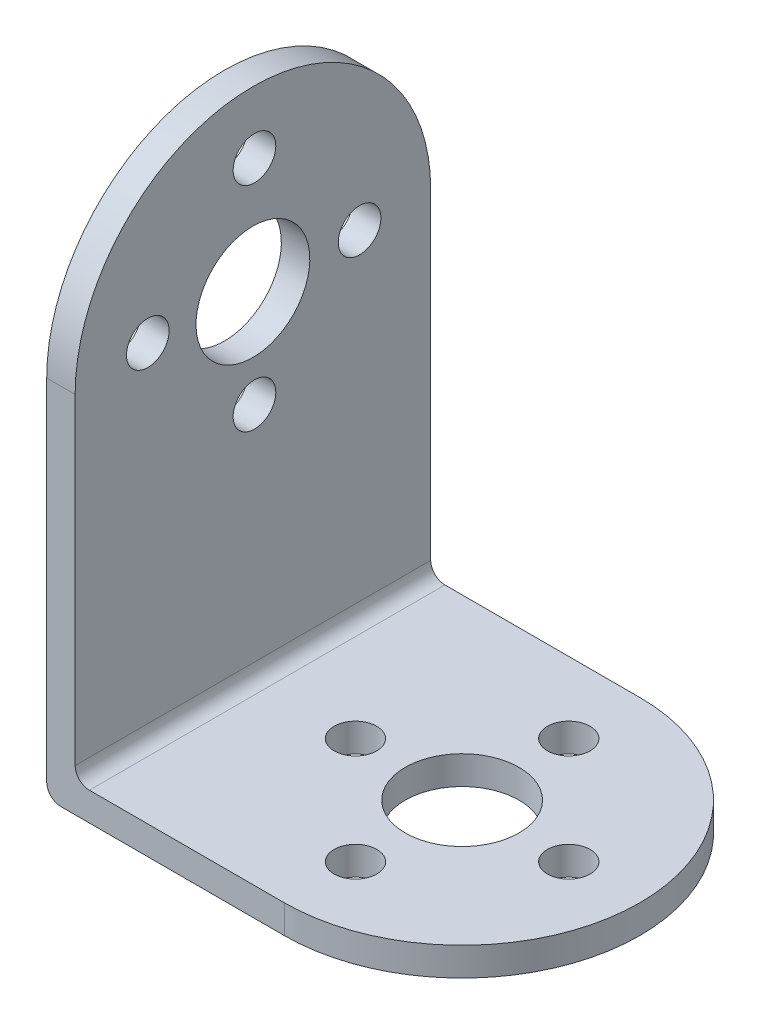
ISO-10303-21;
HEADER;
FILE_DESCRIPTION(('STEP AP214'),'2;1');
FILE_NAME('part.step','',(''),(''),'','','');
FILE_SCHEMA(('AUTOMOTIVE_DESIGN { 1 0 10303 214 1 1 1 1 }'));
ENDSEC;
DATA;
#1=APPLICATION_CONTEXT('core data for automotive mechanical design processes');
#2=APPLICATION_PROTOCOL_DEFINITION('international standard','automotive_design',2000,#1);
#3=PRODUCT_CONTEXT('',#1,'mechanical');
#4=PRODUCT('Part','Part','',(#3));
#5=PRODUCT_RELATED_PRODUCT_CATEGORY('part','',(#4));
#6=PRODUCT_DEFINITION_FORMATION('','',#4);
#7=PRODUCT_DEFINITION_CONTEXT('part definition',#1,'design');
#8=PRODUCT_DEFINITION('design','',#6,#7);
#9=PRODUCT_DEFINITION_SHAPE('','',#8);
#10=(LENGTH_UNIT() NAMED_UNIT(*) SI_UNIT(.MILLI.,.METRE.));
#11=(NAMED_UNIT(*) PLANE_ANGLE_UNIT() SI_UNIT($,.RADIAN.));
#12=(NAMED_UNIT(*) SI_UNIT($,.STERADIAN.) SOLID_ANGLE_UNIT());
#13=UNCERTAINTY_MEASURE_WITH_UNIT(LENGTH_MEASURE(1.E-05),#10,'distance_accuracy_value','');
#14=(GEOMETRIC_REPRESENTATION_CONTEXT(3) GLOBAL_UNCERTAINTY_ASSIGNED_CONTEXT((#13)) GLOBAL_UNIT_ASSIGNED_CONTEXT((#10,
#11,#12)) REPRESENTATION_CONTEXT('',''));
#15=CARTESIAN_POINT('',(0.,0.,0.));
#16=DIRECTION('',(0.,0.,1.));
#17=DIRECTION('',(1.,0.,0.));
#18=AXIS2_PLACEMENT_3D('',#15,#16,#17);
#19=CARTESIAN_POINT('',(0.,0.,25.));
#20=DIRECTION('',(-1.,0.,0.));
#21=DIRECTION('',(0.,0.,1.));
#22=AXIS2_PLACEMENT_3D('',#19,#20,#21);
#23=PLANE('',#22);
#24=CARTESIAN_POINT('',(0.,18.683987084255,12.3909513193394));
#25=DIRECTION('',(-1.,0.,0.));
#26=DIRECTION('',(0.,0.,1.));
#27=AXIS2_PLACEMENT_3D('',#24,#25,#26);
#28=CIRCLE('',#27,1.5);
#29=CARTESIAN_POINT('',(0.,18.683987084255,13.8909513193394));
#30=VERTEX_POINT('',#29);
#31=EDGE_CURVE('E377',#30,#30,#28,.T.);
#32=ORIENTED_EDGE('',*,*,#31,.F.);
#33=EDGE_LOOP('',(#32));
#34=FACE_BOUND('',#33,.T.);
#35=CARTESIAN_POINT('',(0.,25.6000000000001,12.5));
#36=DIRECTION('',(-1.,0.,0.));
#37=DIRECTION('',(0.,0.,1.));
#38=AXIS2_PLACEMENT_3D('',#35,#36,#37);
#39=CIRCLE('',#38,4.);
#40=CARTESIAN_POINT('',(0.,25.6000000000001,16.5));
#41=VERTEX_POINT('',#40);
#42=EDGE_CURVE('E387',#41,#41,#39,.T.);
#43=ORIENTED_EDGE('',*,*,#42,.F.);
#44=EDGE_LOOP('',(#43));
#45=FACE_BOUND('',#44,.T.);
#46=CARTESIAN_POINT('',(0.,26.183987084255,19.8909513193394));
#47=DIRECTION('',(-1.,0.,0.));
#48=DIRECTION('',(0.,0.,1.));
#49=AXIS2_PLACEMENT_3D('',#46,#47,#48);
#50=CIRCLE('',#49,1.5);
#51=CARTESIAN_POINT('',(0.,26.183987084255,21.3909513193394));
#52=VERTEX_POINT('',#51);
#53=EDGE_CURVE('E393',#52,#52,#50,.T.);
#54=ORIENTED_EDGE('',*,*,#53,.F.);
#55=EDGE_LOOP('',(#54));
#56=FACE_BOUND('',#55,.T.);
#57=CARTESIAN_POINT('',(0.,25.6000000000001,5.));
#58=DIRECTION('',(-1.,0.,0.));
#59=DIRECTION('',(0.,0.,1.));
#60=AXIS2_PLACEMENT_3D('',#57,#58,#59);
#61=CIRCLE('',#60,1.5);
#62=CARTESIAN_POINT('',(0.,25.6000000000001,6.50000000000001));
#63=VERTEX_POINT('',#62);
#64=EDGE_CURVE('E399',#63,#63,#61,.T.);
#65=ORIENTED_EDGE('',*,*,#64,.F.);
#66=EDGE_LOOP('',(#65));
#67=FACE_BOUND('',#66,.T.);
#68=CARTESIAN_POINT('',(0.,33.683987084255,12.3909513193394));
#69=DIRECTION('',(-1.,0.,0.));
#70=DIRECTION('',(0.,0.,1.));
#71=AXIS2_PLACEMENT_3D('',#68,#69,#70);
#72=CIRCLE('',#71,1.50000000000001);
#73=CARTESIAN_POINT('',(0.,33.683987084255,13.8909513193394));
#74=VERTEX_POINT('',#73);
#75=EDGE_CURVE('E252',#74,#74,#72,.T.);
#76=ORIENTED_EDGE('',*,*,#75,.F.);
#77=EDGE_LOOP('',(#76));
#78=FACE_BOUND('',#77,.T.);
#79=DIRECTION('',(0.,1.,0.));
#80=VECTOR('',#79,1.);
#81=CARTESIAN_POINT('',(0.,0.,0.));
#82=LINE('',#81,#80);
#83=CARTESIAN_POINT('',(0.,1.,0.));
#84=VERTEX_POINT('',#83);
#85=CARTESIAN_POINT('',(0.,25.6000000000001,0.));
#86=VERTEX_POINT('',#85);
#87=EDGE_CURVE('E260',#84,#86,#82,.T.);
#88=ORIENTED_EDGE('',*,*,#87,.F.);
#89=DIRECTION('',(0.,0.,-1.));
#90=VECTOR('',#89,1.);
#91=CARTESIAN_POINT('',(0.,1.,25.));
#92=LINE('',#91,#90);
#93=CARTESIAN_POINT('',(0.,1.,25.));
#94=VERTEX_POINT('',#93);
#95=EDGE_CURVE('E288',#84,#94,#92,.F.);
#96=ORIENTED_EDGE('',*,*,#95,.T.);
#97=DIRECTION('',(0.,1.,0.));
#98=VECTOR('',#97,1.);
#99=CARTESIAN_POINT('',(0.,0.,25.));
#100=LINE('',#99,#98);
#101=CARTESIAN_POINT('',(0.,25.6000000000001,25.));
#102=VERTEX_POINT('',#101);
#103=EDGE_CURVE('E269',#94,#102,#100,.T.);
#104=ORIENTED_EDGE('',*,*,#103,.T.);
#105=CARTESIAN_POINT('',(0.,25.6000000000001,12.5));
#106=DIRECTION('',(-1.,0.,0.));
#107=DIRECTION('',(0.,0.,1.));
#108=AXIS2_PLACEMENT_3D('',#105,#106,#107);
#109=CIRCLE('',#108,12.5);
#110=EDGE_CURVE('E408',#102,#86,#109,.T.);
#111=ORIENTED_EDGE('',*,*,#110,.T.);
#112=EDGE_LOOP('',(#88,#96,#104,#111));
#113=FACE_BOUND('',#112,.T.);
#114=ADVANCED_FACE('F178',(#34,#45,#56,#67,#78,#113),#23,.T.);
#115=CARTESIAN_POINT('',(2.,0.,25.));
#116=DIRECTION('',(1.,0.,0.));
#117=DIRECTION('',(0.,1.,0.));
#118=AXIS2_PLACEMENT_3D('',#115,#116,#117);
#119=PLANE('',#118);
#120=CARTESIAN_POINT('',(2.,18.683987084255,12.3909513193394));
#121=DIRECTION('',(1.,0.,0.));
#122=DIRECTION('',(0.,1.,0.));
#123=AXIS2_PLACEMENT_3D('',#120,#121,#122);
#124=CIRCLE('',#123,1.5);
#125=CARTESIAN_POINT('',(2.,20.183987084255,12.3909513193394));
#126=VERTEX_POINT('',#125);
#127=EDGE_CURVE('E380',#126,#126,#124,.T.);
#128=ORIENTED_EDGE('',*,*,#127,.F.);
#129=EDGE_LOOP('',(#128));
#130=FACE_BOUND('',#129,.T.);
#131=CARTESIAN_POINT('',(2.,25.6000000000001,12.5));
#132=DIRECTION('',(1.,0.,0.));
#133=DIRECTION('',(0.,1.,0.));
#134=AXIS2_PLACEMENT_3D('',#131,#132,#133);
#135=CIRCLE('',#134,4.);
#136=CARTESIAN_POINT('',(2.,29.6000000000001,12.5));
#137=VERTEX_POINT('',#136);
#138=EDGE_CURVE('E382',#137,#137,#135,.T.);
#139=ORIENTED_EDGE('',*,*,#138,.F.);
#140=EDGE_LOOP('',(#139));
#141=FACE_BOUND('',#140,.T.);
#142=CARTESIAN_POINT('',(2.,26.183987084255,19.8909513193394));
#143=DIRECTION('',(1.,0.,0.));
#144=DIRECTION('',(0.,1.,0.));
#145=AXIS2_PLACEMENT_3D('',#142,#143,#144);
#146=CIRCLE('',#145,1.5);
#147=CARTESIAN_POINT('',(2.,27.683987084255,19.8909513193394));
#148=VERTEX_POINT('',#147);
#149=EDGE_CURVE('E390',#148,#148,#146,.T.);
#150=ORIENTED_EDGE('',*,*,#149,.F.);
#151=EDGE_LOOP('',(#150));
#152=FACE_BOUND('',#151,.T.);
#153=CARTESIAN_POINT('',(2.,25.6000000000001,5.));
#154=DIRECTION('',(1.,0.,0.));
#155=DIRECTION('',(0.,1.,0.));
#156=AXIS2_PLACEMENT_3D('',#153,#154,#155);
#157=CIRCLE('',#156,1.5);
#158=CARTESIAN_POINT('',(2.,27.1000000000001,5.));
#159=VERTEX_POINT('',#158);
#160=EDGE_CURVE('E396',#159,#159,#157,.T.);
#161=ORIENTED_EDGE('',*,*,#160,.F.);
#162=EDGE_LOOP('',(#161));
#163=FACE_BOUND('',#162,.T.);
#164=CARTESIAN_POINT('',(2.,33.683987084255,12.3909513193394));
#165=DIRECTION('',(1.,0.,0.));
#166=DIRECTION('',(0.,1.,0.));
#167=AXIS2_PLACEMENT_3D('',#164,#165,#166);
#168=CIRCLE('',#167,1.50000000000001);
#169=CARTESIAN_POINT('',(2.,35.183987084255,12.3909513193394));
#170=VERTEX_POINT('',#169);
#171=EDGE_CURVE('E402',#170,#170,#168,.T.);
#172=ORIENTED_EDGE('',*,*,#171,.F.);
#173=EDGE_LOOP('',(#172));
#174=FACE_BOUND('',#173,.T.);
#175=DIRECTION('',(0.,-1.,0.));
#176=VECTOR('',#175,1.);
#177=CARTESIAN_POINT('',(2.,0.,25.));
#178=LINE('',#177,#176);
#179=CARTESIAN_POINT('',(2.,25.6000000000001,25.));
#180=VERTEX_POINT('',#179);
#181=CARTESIAN_POINT('',(2.,3.,25.));
#182=VERTEX_POINT('',#181);
#183=EDGE_CURVE('E281',#180,#182,#178,.T.);
#184=ORIENTED_EDGE('',*,*,#183,.T.);
#185=DIRECTION('',(0.,0.,-1.));
#186=VECTOR('',#185,1.);
#187=CARTESIAN_POINT('',(2.,3.,0.));
#188=LINE('',#187,#186);
#189=CARTESIAN_POINT('',(2.,3.,0.));
#190=VERTEX_POINT('',#189);
#191=EDGE_CURVE('E268',#182,#190,#188,.T.);
#192=ORIENTED_EDGE('',*,*,#191,.T.);
#193=DIRECTION('',(0.,-1.,0.));
#194=VECTOR('',#193,1.);
#195=CARTESIAN_POINT('',(2.,0.,0.));
#196=LINE('',#195,#194);
#197=CARTESIAN_POINT('',(2.,25.6000000000001,0.));
#198=VERTEX_POINT('',#197);
#199=EDGE_CURVE('E258',#198,#190,#196,.T.);
#200=ORIENTED_EDGE('',*,*,#199,.F.);
#201=CARTESIAN_POINT('',(2.,25.6000000000001,12.5));
#202=DIRECTION('',(1.,0.,0.));
#203=DIRECTION('',(0.,1.,0.));
#204=AXIS2_PLACEMENT_3D('',#201,#202,#203);
#205=CIRCLE('',#204,12.5);
#206=EDGE_CURVE('E243',#198,#180,#205,.T.);
#207=ORIENTED_EDGE('',*,*,#206,.T.);
#208=EDGE_LOOP('',(#184,#192,#200,#207));
#209=FACE_BOUND('',#208,.T.);
#210=ADVANCED_FACE('F266',(#130,#141,#152,#163,#174,#209),#119,.T.);
#211=CARTESIAN_POINT('',(0.,0.,25.));
#212=DIRECTION('',(0.,1.,0.));
#213=DIRECTION('',(0.,0.,1.));
#214=AXIS2_PLACEMENT_3D('',#211,#212,#213);
#215=PLANE('',#214);
#216=CARTESIAN_POINT('',(16.71,0.,12.5));
#217=DIRECTION('',(0.,1.,0.));
#218=DIRECTION('',(0.,0.,1.));
#219=AXIS2_PLACEMENT_3D('',#216,#217,#218);
#220=CIRCLE('',#219,4.);
#221=CARTESIAN_POINT('',(16.71,0.,16.5));
#222=VERTEX_POINT('',#221);
#223=EDGE_CURVE('E417',#222,#222,#220,.T.);
#224=ORIENTED_EDGE('',*,*,#223,.T.);
#225=EDGE_LOOP('',(#224));
#226=FACE_BOUND('',#225,.T.);
#227=CARTESIAN_POINT('',(24.21,0.,12.5));
#228=DIRECTION('',(0.,1.,0.));
#229=DIRECTION('',(0.,0.,1.));
#230=AXIS2_PLACEMENT_3D('',#227,#228,#229);
#231=CIRCLE('',#230,1.5);
#232=CARTESIAN_POINT('',(24.21,0.,14.));
#233=VERTEX_POINT('',#232);
#234=EDGE_CURVE('E423',#233,#233,#231,.T.);
#235=ORIENTED_EDGE('',*,*,#234,.T.);
#236=EDGE_LOOP('',(#235));
#237=FACE_BOUND('',#236,.T.);
#238=CARTESIAN_POINT('',(16.71,0.,5.));
#239=DIRECTION('',(0.,1.,0.));
#240=DIRECTION('',(0.,0.,1.));
#241=AXIS2_PLACEMENT_3D('',#238,#239,#240);
#242=CIRCLE('',#241,1.5);
#243=CARTESIAN_POINT('',(16.71,0.,6.5));
#244=VERTEX_POINT('',#243);
#245=EDGE_CURVE('E429',#244,#244,#242,.T.);
#246=ORIENTED_EDGE('',*,*,#245,.T.);
#247=EDGE_LOOP('',(#246));
#248=FACE_BOUND('',#247,.T.);
#249=CARTESIAN_POINT('',(9.21,0.,12.5));
#250=DIRECTION('',(0.,1.,0.));
#251=DIRECTION('',(0.,0.,1.));
#252=AXIS2_PLACEMENT_3D('',#249,#250,#251);
#253=CIRCLE('',#252,1.5);
#254=CARTESIAN_POINT('',(9.21,0.,14.));
#255=VERTEX_POINT('',#254);
#256=EDGE_CURVE('E435',#255,#255,#253,.T.);
#257=ORIENTED_EDGE('',*,*,#256,.T.);
#258=EDGE_LOOP('',(#257));
#259=FACE_BOUND('',#258,.T.);
#260=CARTESIAN_POINT('',(16.71,0.,20.));
#261=DIRECTION('',(0.,1.,0.));
#262=DIRECTION('',(0.,0.,1.));
#263=AXIS2_PLACEMENT_3D('',#260,#261,#262);
#264=CIRCLE('',#263,1.5);
#265=CARTESIAN_POINT('',(16.71,0.,21.5));
#266=VERTEX_POINT('',#265);
#267=EDGE_CURVE('E441',#266,#266,#264,.T.);
#268=ORIENTED_EDGE('',*,*,#267,.T.);
#269=EDGE_LOOP('',(#268));
#270=FACE_BOUND('',#269,.T.);
#271=DIRECTION('',(1.,0.,0.));
#272=VECTOR('',#271,1.);
#273=CARTESIAN_POINT('',(0.,0.,25.));
#274=LINE('',#273,#272);
#275=CARTESIAN_POINT('',(1.,0.,25.));
#276=VERTEX_POINT('',#275);
#277=CARTESIAN_POINT('',(16.71,0.,25.));
#278=VERTEX_POINT('',#277);
#279=EDGE_CURVE('E272',#276,#278,#274,.T.);
#280=ORIENTED_EDGE('',*,*,#279,.F.);
#281=DIRECTION('',(0.,0.,-1.));
#282=VECTOR('',#281,1.);
#283=CARTESIAN_POINT('',(1.,0.,0.));
#284=LINE('',#283,#282);
#285=CARTESIAN_POINT('',(1.,0.,0.));
#286=VERTEX_POINT('',#285);
#287=EDGE_CURVE('E262',#276,#286,#284,.T.);
#288=ORIENTED_EDGE('',*,*,#287,.T.);
#289=DIRECTION('',(1.,0.,0.));
#290=VECTOR('',#289,1.);
#291=CARTESIAN_POINT('',(0.,0.,0.));
#292=LINE('',#291,#290);
#293=CARTESIAN_POINT('',(16.71,0.,0.));
#294=VERTEX_POINT('',#293);
#295=EDGE_CURVE('E274',#286,#294,#292,.T.);
#296=ORIENTED_EDGE('',*,*,#295,.T.);
#297=CARTESIAN_POINT('',(16.71,0.,12.5));
#298=DIRECTION('',(0.,1.,0.));
#299=DIRECTION('',(0.,0.,1.));
#300=AXIS2_PLACEMENT_3D('',#297,#298,#299);
#301=CIRCLE('',#300,12.5);
#302=EDGE_CURVE('E411',#278,#294,#301,.T.);
#303=ORIENTED_EDGE('',*,*,#302,.F.);
#304=EDGE_LOOP('',(#280,#288,#296,#303));
#305=FACE_BOUND('',#304,.T.);
#306=ADVANCED_FACE('F312',(#226,#237,#248,#259,#270,#305),#215,.F.);
#307=CARTESIAN_POINT('',(0.,2.,25.));
#308=DIRECTION('',(0.,1.,0.));
#309=DIRECTION('',(0.,0.,1.));
#310=AXIS2_PLACEMENT_3D('',#307,#308,#309);
#311=PLANE('',#310);
#312=CARTESIAN_POINT('',(16.71,2.,12.5));
#313=DIRECTION('',(0.,1.,0.));
#314=DIRECTION('',(0.,0.,1.));
#315=AXIS2_PLACEMENT_3D('',#312,#313,#314);
#316=CIRCLE('',#315,4.);
#317=CARTESIAN_POINT('',(16.71,2.,16.5));
#318=VERTEX_POINT('',#317);
#319=EDGE_CURVE('E414',#318,#318,#316,.T.);
#320=ORIENTED_EDGE('',*,*,#319,.F.);
#321=EDGE_LOOP('',(#320));
#322=FACE_BOUND('',#321,.T.);
#323=CARTESIAN_POINT('',(24.21,2.,12.5));
#324=DIRECTION('',(0.,1.,0.));
#325=DIRECTION('',(0.,0.,1.));
#326=AXIS2_PLACEMENT_3D('',#323,#324,#325);
#327=CIRCLE('',#326,1.5);
#328=CARTESIAN_POINT('',(24.21,2.,14.));
#329=VERTEX_POINT('',#328);
#330=EDGE_CURVE('E420',#329,#329,#327,.T.);
#331=ORIENTED_EDGE('',*,*,#330,.F.);
#332=EDGE_LOOP('',(#331));
#333=FACE_BOUND('',#332,.T.);
#334=CARTESIAN_POINT('',(16.71,2.,5.));
#335=DIRECTION('',(0.,1.,0.));
#336=DIRECTION('',(0.,0.,1.));
#337=AXIS2_PLACEMENT_3D('',#334,#335,#336);
#338=CIRCLE('',#337,1.5);
#339=CARTESIAN_POINT('',(16.71,2.,6.5));
#340=VERTEX_POINT('',#339);
#341=EDGE_CURVE('E426',#340,#340,#338,.T.);
#342=ORIENTED_EDGE('',*,*,#341,.F.);
#343=EDGE_LOOP('',(#342));
#344=FACE_BOUND('',#343,.T.);
#345=CARTESIAN_POINT('',(9.21,2.,12.5));
#346=DIRECTION('',(0.,1.,0.));
#347=DIRECTION('',(0.,0.,1.));
#348=AXIS2_PLACEMENT_3D('',#345,#346,#347);
#349=CIRCLE('',#348,1.5);
#350=CARTESIAN_POINT('',(9.21,2.,14.));
#351=VERTEX_POINT('',#350);
#352=EDGE_CURVE('E432',#351,#351,#349,.T.);
#353=ORIENTED_EDGE('',*,*,#352,.F.);
#354=EDGE_LOOP('',(#353));
#355=FACE_BOUND('',#354,.T.);
#356=CARTESIAN_POINT('',(16.71,2.,20.));
#357=DIRECTION('',(0.,1.,0.));
#358=DIRECTION('',(0.,0.,1.));
#359=AXIS2_PLACEMENT_3D('',#356,#357,#358);
#360=CIRCLE('',#359,1.5);
#361=CARTESIAN_POINT('',(16.71,2.,21.5));
#362=VERTEX_POINT('',#361);
#363=EDGE_CURVE('E438',#362,#362,#360,.T.);
#364=ORIENTED_EDGE('',*,*,#363,.F.);
#365=EDGE_LOOP('',(#364));
#366=FACE_BOUND('',#365,.T.);
#367=DIRECTION('',(1.,0.,0.));
#368=VECTOR('',#367,1.);
#369=CARTESIAN_POINT('',(0.,2.,0.));
#370=LINE('',#369,#368);
#371=CARTESIAN_POINT('',(3.,2.,0.));
#372=VERTEX_POINT('',#371);
#373=CARTESIAN_POINT('',(16.71,2.,0.));
#374=VERTEX_POINT('',#373);
#375=EDGE_CURVE('E270',#372,#374,#370,.T.);
#376=ORIENTED_EDGE('',*,*,#375,.F.);
#377=DIRECTION('',(0.,0.,-1.));
#378=VECTOR('',#377,1.);
#379=CARTESIAN_POINT('',(3.,2.,25.));
#380=LINE('',#379,#378);
#381=CARTESIAN_POINT('',(3.,2.,25.));
#382=VERTEX_POINT('',#381);
#383=EDGE_CURVE('E199',#372,#382,#380,.F.);
#384=ORIENTED_EDGE('',*,*,#383,.T.);
#385=DIRECTION('',(1.,0.,0.));
#386=VECTOR('',#385,1.);
#387=CARTESIAN_POINT('',(0.,2.,25.));
#388=LINE('',#387,#386);
#389=CARTESIAN_POINT('',(16.71,2.,25.));
#390=VERTEX_POINT('',#389);
#391=EDGE_CURVE('E445',#382,#390,#388,.T.);
#392=ORIENTED_EDGE('',*,*,#391,.T.);
#393=CARTESIAN_POINT('',(16.71,2.,12.5));
#394=DIRECTION('',(0.,1.,0.));
#395=DIRECTION('',(0.,0.,1.));
#396=AXIS2_PLACEMENT_3D('',#393,#394,#395);
#397=CIRCLE('',#396,12.5);
#398=EDGE_CURVE('E298',#390,#374,#397,.T.);
#399=ORIENTED_EDGE('',*,*,#398,.T.);
#400=EDGE_LOOP('',(#376,#384,#392,#399));
#401=FACE_BOUND('',#400,.T.);
#402=ADVANCED_FACE('F296',(#322,#333,#344,#355,#366,#401),#311,.T.);
#403=CARTESIAN_POINT('',(0.,0.,25.));
#404=DIRECTION('',(0.,0.,1.));
#405=DIRECTION('',(1.,0.,0.));
#406=AXIS2_PLACEMENT_3D('',#403,#404,#405);
#407=PLANE('',#406);
#408=ORIENTED_EDGE('',*,*,#103,.F.);
#409=CARTESIAN_POINT('',(1.,1.,25.));
#410=DIRECTION('',(0.,0.,1.));
#411=DIRECTION('',(1.,0.,0.));
#412=AXIS2_PLACEMENT_3D('',#409,#410,#411);
#413=CIRCLE('',#412,1.);
#414=EDGE_CURVE('E290',#94,#276,#413,.T.);
#415=ORIENTED_EDGE('',*,*,#414,.T.);
#416=ORIENTED_EDGE('',*,*,#279,.T.);
#417=DIRECTION('',(0.,1.,0.));
#418=VECTOR('',#417,1.);
#419=CARTESIAN_POINT('',(16.71,-23.,25.));
#420=LINE('',#419,#418);
#421=EDGE_CURVE('E263',#278,#390,#420,.T.);
#422=ORIENTED_EDGE('',*,*,#421,.T.);
#423=ORIENTED_EDGE('',*,*,#391,.F.);
#424=CARTESIAN_POINT('',(3.,3.,25.));
#425=DIRECTION('',(0.,0.,1.));
#426=DIRECTION('',(1.,0.,0.));
#427=AXIS2_PLACEMENT_3D('',#424,#425,#426);
#428=CIRCLE('',#427,1.);
#429=EDGE_CURVE('E12',#382,#182,#428,.F.);
#430=ORIENTED_EDGE('',*,*,#429,.T.);
#431=ORIENTED_EDGE('',*,*,#183,.F.);
#432=DIRECTION('',(1.,0.,0.));
#433=VECTOR('',#432,1.);
#434=CARTESIAN_POINT('',(-23.,25.6000000000001,25.));
#435=LINE('',#434,#433);
#436=EDGE_CURVE('E249',#102,#180,#435,.T.);
#437=ORIENTED_EDGE('',*,*,#436,.F.);
#438=EDGE_LOOP('',(#408,#415,#416,#422,#423,#430,#431,#437));
#439=FACE_BOUND('',#438,.T.);
#440=ADVANCED_FACE('F322',(#439),#407,.T.);
#441=CARTESIAN_POINT('',(0.,0.,0.));
#442=DIRECTION('',(0.,0.,1.));
#443=DIRECTION('',(1.,0.,0.));
#444=AXIS2_PLACEMENT_3D('',#441,#442,#443);
#445=PLANE('',#444);
#446=ORIENTED_EDGE('',*,*,#295,.F.);
#447=CARTESIAN_POINT('',(1.,1.,0.));
#448=DIRECTION('',(0.,0.,1.));
#449=DIRECTION('',(1.,0.,0.));
#450=AXIS2_PLACEMENT_3D('',#447,#448,#449);
#451=CIRCLE('',#450,1.);
#452=EDGE_CURVE('E286',#286,#84,#451,.F.);
#453=ORIENTED_EDGE('',*,*,#452,.T.);
#454=ORIENTED_EDGE('',*,*,#87,.T.);
#455=DIRECTION('',(1.,0.,0.));
#456=VECTOR('',#455,1.);
#457=CARTESIAN_POINT('',(-23.,25.6000000000001,0.));
#458=LINE('',#457,#456);
#459=EDGE_CURVE('E247',#86,#198,#458,.T.);
#460=ORIENTED_EDGE('',*,*,#459,.T.);
#461=ORIENTED_EDGE('',*,*,#199,.T.);
#462=CARTESIAN_POINT('',(3.,3.,0.));
#463=DIRECTION('',(0.,0.,1.));
#464=DIRECTION('',(1.,0.,0.));
#465=AXIS2_PLACEMENT_3D('',#462,#463,#464);
#466=CIRCLE('',#465,1.);
#467=EDGE_CURVE('E186',#190,#372,#466,.T.);
#468=ORIENTED_EDGE('',*,*,#467,.T.);
#469=ORIENTED_EDGE('',*,*,#375,.T.);
#470=DIRECTION('',(0.,1.,0.));
#471=VECTOR('',#470,1.);
#472=CARTESIAN_POINT('',(16.71,-23.,0.));
#473=LINE('',#472,#471);
#474=EDGE_CURVE('E278',#294,#374,#473,.T.);
#475=ORIENTED_EDGE('',*,*,#474,.F.);
#476=EDGE_LOOP('',(#446,#453,#454,#460,#461,#468,#469,#475));
#477=FACE_BOUND('',#476,.T.);
#478=ADVANCED_FACE('F257',(#477),#445,.F.);
#479=CARTESIAN_POINT('',(16.71,-23.,20.));
#480=DIRECTION('',(0.,1.,0.));
#481=DIRECTION('',(0.,0.,1.));
#482=AXIS2_PLACEMENT_3D('',#479,#480,#481);
#483=CYLINDRICAL_SURFACE('',#482,1.5);
#484=ORIENTED_EDGE('',*,*,#363,.T.);
#485=EDGE_LOOP('',(#484));
#486=FACE_BOUND('',#485,.T.);
#487=ORIENTED_EDGE('',*,*,#267,.F.);
#488=EDGE_LOOP('',(#487));
#489=FACE_BOUND('',#488,.T.);
#490=ADVANCED_FACE('F327',(#486,#489),#483,.F.);
#491=CARTESIAN_POINT('',(9.21,-23.,12.5));
#492=DIRECTION('',(0.,1.,0.));
#493=DIRECTION('',(0.,0.,1.));
#494=AXIS2_PLACEMENT_3D('',#491,#492,#493);
#495=CYLINDRICAL_SURFACE('',#494,1.5);
#496=ORIENTED_EDGE('',*,*,#352,.T.);
#497=EDGE_LOOP('',(#496));
#498=FACE_BOUND('',#497,.T.);
#499=ORIENTED_EDGE('',*,*,#256,.F.);
#500=EDGE_LOOP('',(#499));
#501=FACE_BOUND('',#500,.T.);
#502=ADVANCED_FACE('F332',(#498,#501),#495,.F.);
#503=CARTESIAN_POINT('',(16.71,-23.,5.));
#504=DIRECTION('',(0.,1.,0.));
#505=DIRECTION('',(0.,0.,1.));
#506=AXIS2_PLACEMENT_3D('',#503,#504,#505);
#507=CYLINDRICAL_SURFACE('',#506,1.5);
#508=ORIENTED_EDGE('',*,*,#341,.T.);
#509=EDGE_LOOP('',(#508));
#510=FACE_BOUND('',#509,.T.);
#511=ORIENTED_EDGE('',*,*,#245,.F.);
#512=EDGE_LOOP('',(#511));
#513=FACE_BOUND('',#512,.T.);
#514=ADVANCED_FACE('F336',(#510,#513),#507,.F.);
#515=CARTESIAN_POINT('',(24.21,-23.,12.5));
#516=DIRECTION('',(0.,1.,0.));
#517=DIRECTION('',(0.,0.,1.));
#518=AXIS2_PLACEMENT_3D('',#515,#516,#517);
#519=CYLINDRICAL_SURFACE('',#518,1.5);
#520=ORIENTED_EDGE('',*,*,#330,.T.);
#521=EDGE_LOOP('',(#520));
#522=FACE_BOUND('',#521,.T.);
#523=ORIENTED_EDGE('',*,*,#234,.F.);
#524=EDGE_LOOP('',(#523));
#525=FACE_BOUND('',#524,.T.);
#526=ADVANCED_FACE('F340',(#522,#525),#519,.F.);
#527=CARTESIAN_POINT('',(16.71,-23.,12.5));
#528=DIRECTION('',(0.,1.,0.));
#529=DIRECTION('',(0.,0.,1.));
#530=AXIS2_PLACEMENT_3D('',#527,#528,#529);
#531=CYLINDRICAL_SURFACE('',#530,4.);
#532=ORIENTED_EDGE('',*,*,#319,.T.);
#533=EDGE_LOOP('',(#532));
#534=FACE_BOUND('',#533,.T.);
#535=ORIENTED_EDGE('',*,*,#223,.F.);
#536=EDGE_LOOP('',(#535));
#537=FACE_BOUND('',#536,.T.);
#538=ADVANCED_FACE('F344',(#534,#537),#531,.F.);
#539=CARTESIAN_POINT('',(16.71,-23.,12.5));
#540=DIRECTION('',(0.,1.,0.));
#541=DIRECTION('',(0.,0.,1.));
#542=AXIS2_PLACEMENT_3D('',#539,#540,#541);
#543=CYLINDRICAL_SURFACE('',#542,12.5);
#544=ORIENTED_EDGE('',*,*,#302,.T.);
#545=ORIENTED_EDGE('',*,*,#474,.T.);
#546=ORIENTED_EDGE('',*,*,#398,.F.);
#547=ORIENTED_EDGE('',*,*,#421,.F.);
#548=EDGE_LOOP('',(#544,#545,#546,#547));
#549=FACE_BOUND('',#548,.T.);
#550=ADVANCED_FACE('F348',(#549),#543,.T.);
#551=CARTESIAN_POINT('',(-23.,25.6000000000001,12.5));
#552=DIRECTION('',(1.,0.,0.));
#553=DIRECTION('',(0.,1.,0.));
#554=AXIS2_PLACEMENT_3D('',#551,#552,#553);
#555=CYLINDRICAL_SURFACE('',#554,12.5);
#556=ORIENTED_EDGE('',*,*,#436,.T.);
#557=ORIENTED_EDGE('',*,*,#206,.F.);
#558=ORIENTED_EDGE('',*,*,#459,.F.);
#559=ORIENTED_EDGE('',*,*,#110,.F.);
#560=EDGE_LOOP('',(#556,#557,#558,#559));
#561=FACE_BOUND('',#560,.T.);
#562=ADVANCED_FACE('F245',(#561),#555,.T.);
#563=CARTESIAN_POINT('',(-23.,33.683987084255,12.3909513193394));
#564=DIRECTION('',(1.,0.,0.));
#565=DIRECTION('',(0.,1.,0.));
#566=AXIS2_PLACEMENT_3D('',#563,#564,#565);
#567=CYLINDRICAL_SURFACE('',#566,1.50000000000001);
#568=ORIENTED_EDGE('',*,*,#75,.T.);
#569=EDGE_LOOP('',(#568));
#570=FACE_BOUND('',#569,.T.);
#571=ORIENTED_EDGE('',*,*,#171,.T.);
#572=EDGE_LOOP('',(#571));
#573=FACE_BOUND('',#572,.T.);
#574=ADVANCED_FACE('F355',(#570,#573),#567,.F.);
#575=CARTESIAN_POINT('',(-23.,25.6000000000001,5.));
#576=DIRECTION('',(1.,0.,0.));
#577=DIRECTION('',(0.,1.,0.));
#578=AXIS2_PLACEMENT_3D('',#575,#576,#577);
#579=CYLINDRICAL_SURFACE('',#578,1.5);
#580=ORIENTED_EDGE('',*,*,#64,.T.);
#581=EDGE_LOOP('',(#580));
#582=FACE_BOUND('',#581,.T.);
#583=ORIENTED_EDGE('',*,*,#160,.T.);
#584=EDGE_LOOP('',(#583));
#585=FACE_BOUND('',#584,.T.);
#586=ADVANCED_FACE('F358',(#582,#585),#579,.F.);
#587=CARTESIAN_POINT('',(-23.,26.183987084255,19.8909513193394));
#588=DIRECTION('',(1.,0.,0.));
#589=DIRECTION('',(0.,1.,0.));
#590=AXIS2_PLACEMENT_3D('',#587,#588,#589);
#591=CYLINDRICAL_SURFACE('',#590,1.5);
#592=ORIENTED_EDGE('',*,*,#53,.T.);
#593=EDGE_LOOP('',(#592));
#594=FACE_BOUND('',#593,.T.);
#595=ORIENTED_EDGE('',*,*,#149,.T.);
#596=EDGE_LOOP('',(#595));
#597=FACE_BOUND('',#596,.T.);
#598=ADVANCED_FACE('F362',(#594,#597),#591,.F.);
#599=CARTESIAN_POINT('',(-23.,25.6000000000001,12.5));
#600=DIRECTION('',(1.,0.,0.));
#601=DIRECTION('',(0.,1.,0.));
#602=AXIS2_PLACEMENT_3D('',#599,#600,#601);
#603=CYLINDRICAL_SURFACE('',#602,4.);
#604=ORIENTED_EDGE('',*,*,#42,.T.);
#605=EDGE_LOOP('',(#604));
#606=FACE_BOUND('',#605,.T.);
#607=ORIENTED_EDGE('',*,*,#138,.T.);
#608=EDGE_LOOP('',(#607));
#609=FACE_BOUND('',#608,.T.);
#610=ADVANCED_FACE('F366',(#606,#609),#603,.F.);
#611=CARTESIAN_POINT('',(-23.,18.683987084255,12.3909513193394));
#612=DIRECTION('',(1.,0.,0.));
#613=DIRECTION('',(0.,1.,0.));
#614=AXIS2_PLACEMENT_3D('',#611,#612,#613);
#615=CYLINDRICAL_SURFACE('',#614,1.5);
#616=ORIENTED_EDGE('',*,*,#31,.T.);
#617=EDGE_LOOP('',(#616));
#618=FACE_BOUND('',#617,.T.);
#619=ORIENTED_EDGE('',*,*,#127,.T.);
#620=EDGE_LOOP('',(#619));
#621=FACE_BOUND('',#620,.T.);
#622=ADVANCED_FACE('F304',(#618,#621),#615,.F.);
#623=CARTESIAN_POINT('',(1.,1.,25.));
#624=DIRECTION('',(0.,0.,1.));
#625=DIRECTION('',(1.,0.,0.));
#626=AXIS2_PLACEMENT_3D('',#623,#624,#625);
#627=CYLINDRICAL_SURFACE('',#626,1.);
#628=ORIENTED_EDGE('',*,*,#414,.F.);
#629=ORIENTED_EDGE('',*,*,#95,.F.);
#630=ORIENTED_EDGE('',*,*,#452,.F.);
#631=ORIENTED_EDGE('',*,*,#287,.F.);
#632=EDGE_LOOP('',(#628,#629,#630,#631));
#633=FACE_BOUND('',#632,.T.);
#634=ADVANCED_FACE('F300',(#633),#627,.T.);
#635=CARTESIAN_POINT('',(3.,3.,25.));
#636=DIRECTION('',(0.,0.,1.));
#637=DIRECTION('',(1.,0.,0.));
#638=AXIS2_PLACEMENT_3D('',#635,#636,#637);
#639=CYLINDRICAL_SURFACE('',#638,1.);
#640=ORIENTED_EDGE('',*,*,#429,.F.);
#641=ORIENTED_EDGE('',*,*,#383,.F.);
#642=ORIENTED_EDGE('',*,*,#467,.F.);
#643=ORIENTED_EDGE('',*,*,#191,.F.);
#644=EDGE_LOOP('',(#640,#641,#642,#643));
#645=FACE_BOUND('',#644,.T.);
#646=ADVANCED_FACE('F180',(#645),#639,.F.);
#647=CLOSED_SHELL('',(#114,#210,#306,#402,#440,#478,#490,#502,#514,#526,#538,#550,#562,#574,
#586,#598,#610,#622,#634,#646));
#648=MANIFOLD_SOLID_BREP('B2',#647);
#649=ADVANCED_BREP_SHAPE_REPRESENTATION('',(#18,#648),#14);
#650=SHAPE_DEFINITION_REPRESENTATION(#9,#649);
ENDSEC;
END-ISO-10303-21;
